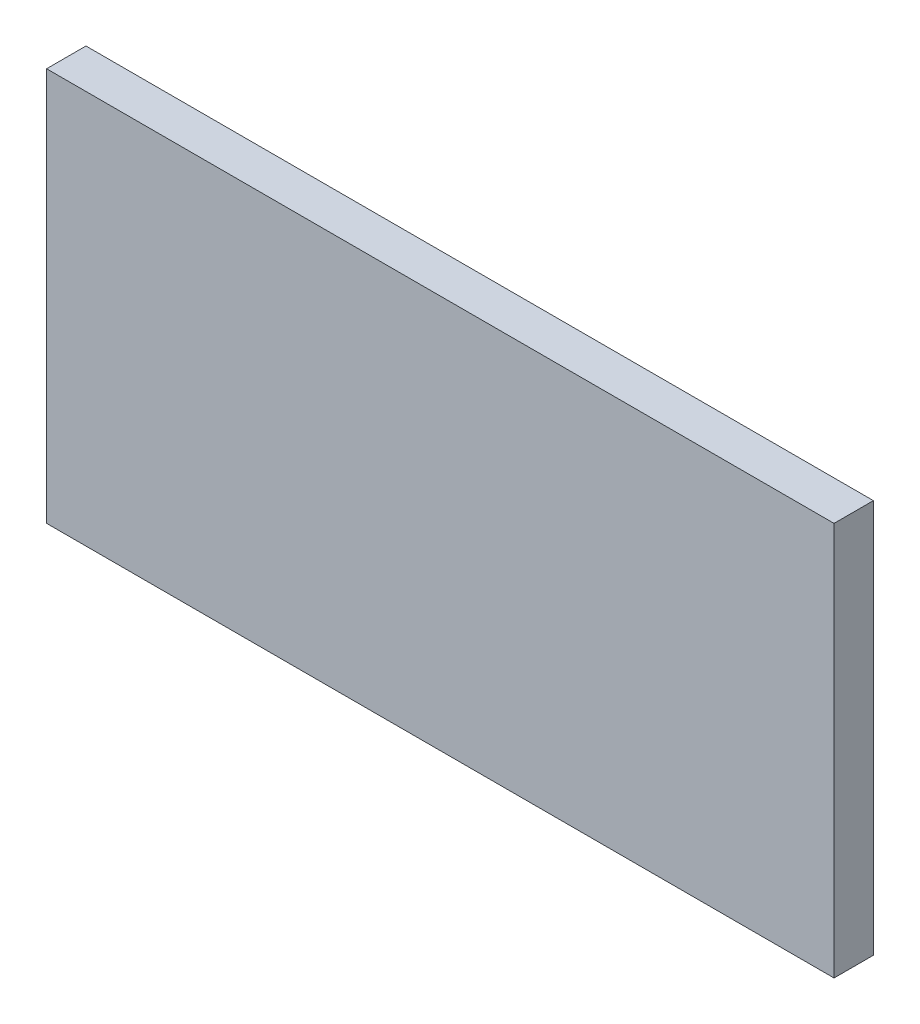
ISO-10303-21;
HEADER;
FILE_DESCRIPTION(('STEP AP214'),'2;1');
FILE_NAME('part.step','',(''),(''),'','','');
FILE_SCHEMA(('AUTOMOTIVE_DESIGN { 1 0 10303 214 1 1 1 1 }'));
ENDSEC;
DATA;
#1=APPLICATION_CONTEXT('core data for automotive mechanical design processes');
#2=APPLICATION_PROTOCOL_DEFINITION('international standard','automotive_design',2000,#1);
#3=PRODUCT_CONTEXT('',#1,'mechanical');
#4=PRODUCT('Part','Part','',(#3));
#5=PRODUCT_RELATED_PRODUCT_CATEGORY('part','',(#4));
#6=PRODUCT_DEFINITION_FORMATION('','',#4);
#7=PRODUCT_DEFINITION_CONTEXT('part definition',#1,'design');
#8=PRODUCT_DEFINITION('design','',#6,#7);
#9=PRODUCT_DEFINITION_SHAPE('','',#8);
#10=(LENGTH_UNIT() NAMED_UNIT(*) SI_UNIT(.MILLI.,.METRE.));
#11=(NAMED_UNIT(*) PLANE_ANGLE_UNIT() SI_UNIT($,.RADIAN.));
#12=(NAMED_UNIT(*) SI_UNIT($,.STERADIAN.) SOLID_ANGLE_UNIT());
#13=UNCERTAINTY_MEASURE_WITH_UNIT(LENGTH_MEASURE(1.E-05),#10,'distance_accuracy_value','');
#14=(GEOMETRIC_REPRESENTATION_CONTEXT(3) GLOBAL_UNCERTAINTY_ASSIGNED_CONTEXT((#13)) GLOBAL_UNIT_ASSIGNED_CONTEXT((#10,
#11,#12)) REPRESENTATION_CONTEXT('',''));
#15=CARTESIAN_POINT('',(0.,0.,0.));
#16=DIRECTION('',(0.,0.,1.));
#17=DIRECTION('',(1.,0.,0.));
#18=AXIS2_PLACEMENT_3D('',#15,#16,#17);
#19=CARTESIAN_POINT('',(0.,0.,1.27));
#20=DIRECTION('',(1.,0.,0.));
#21=DIRECTION('',(0.,0.,-1.));
#22=AXIS2_PLACEMENT_3D('',#19,#20,#21);
#23=PLANE('',#22);
#24=DIRECTION('',(0.,-1.,0.));
#25=VECTOR('',#24,1.);
#26=CARTESIAN_POINT('',(0.,0.,0.));
#27=LINE('',#26,#25);
#28=CARTESIAN_POINT('',(0.,12.7,0.));
#29=VERTEX_POINT('',#28);
#30=CARTESIAN_POINT('',(0.,0.,0.));
#31=VERTEX_POINT('',#30);
#32=EDGE_CURVE('E107',#29,#31,#27,.T.);
#33=ORIENTED_EDGE('',*,*,#32,.T.);
#34=DIRECTION('',(0.,0.,-1.));
#35=VECTOR('',#34,1.);
#36=CARTESIAN_POINT('',(0.,0.,1.27));
#37=LINE('',#36,#35);
#38=CARTESIAN_POINT('',(0.,0.,1.27));
#39=VERTEX_POINT('',#38);
#40=EDGE_CURVE('E11',#39,#31,#37,.T.);
#41=ORIENTED_EDGE('',*,*,#40,.F.);
#42=DIRECTION('',(0.,-1.,0.));
#43=VECTOR('',#42,1.);
#44=CARTESIAN_POINT('',(0.,0.,1.27));
#45=LINE('',#44,#43);
#46=CARTESIAN_POINT('',(0.,12.7,1.27));
#47=VERTEX_POINT('',#46);
#48=EDGE_CURVE('E91',#47,#39,#45,.T.);
#49=ORIENTED_EDGE('',*,*,#48,.F.);
#50=DIRECTION('',(0.,0.,-1.));
#51=VECTOR('',#50,1.);
#52=CARTESIAN_POINT('',(0.,12.7,1.27));
#53=LINE('',#52,#51);
#54=EDGE_CURVE('E103',#47,#29,#53,.T.);
#55=ORIENTED_EDGE('',*,*,#54,.T.);
#56=EDGE_LOOP('',(#33,#41,#49,#55));
#57=FACE_BOUND('',#56,.T.);
#58=ADVANCED_FACE('F39',(#57),#23,.F.);
#59=CARTESIAN_POINT('',(0.,0.,1.27));
#60=DIRECTION('',(0.,1.,0.));
#61=DIRECTION('',(0.,0.,1.));
#62=AXIS2_PLACEMENT_3D('',#59,#60,#61);
#63=PLANE('',#62);
#64=DIRECTION('',(1.,0.,0.));
#65=VECTOR('',#64,1.);
#66=CARTESIAN_POINT('',(0.,0.,0.));
#67=LINE('',#66,#65);
#68=CARTESIAN_POINT('',(25.4,0.,0.));
#69=VERTEX_POINT('',#68);
#70=EDGE_CURVE('E96',#31,#69,#67,.T.);
#71=ORIENTED_EDGE('',*,*,#70,.T.);
#72=DIRECTION('',(0.,0.,-1.));
#73=VECTOR('',#72,1.);
#74=CARTESIAN_POINT('',(25.4,0.,1.27));
#75=LINE('',#74,#73);
#76=CARTESIAN_POINT('',(25.4,0.,1.27));
#77=VERTEX_POINT('',#76);
#78=EDGE_CURVE('E48',#77,#69,#75,.T.);
#79=ORIENTED_EDGE('',*,*,#78,.F.);
#80=DIRECTION('',(1.,0.,0.));
#81=VECTOR('',#80,1.);
#82=CARTESIAN_POINT('',(0.,0.,1.27));
#83=LINE('',#82,#81);
#84=EDGE_CURVE('E86',#39,#77,#83,.T.);
#85=ORIENTED_EDGE('',*,*,#84,.F.);
#86=ORIENTED_EDGE('',*,*,#40,.T.);
#87=EDGE_LOOP('',(#71,#79,#85,#86));
#88=FACE_BOUND('',#87,.T.);
#89=ADVANCED_FACE('F95',(#88),#63,.F.);
#90=CARTESIAN_POINT('',(25.4,0.,1.27));
#91=DIRECTION('',(-1.,0.,0.));
#92=DIRECTION('',(0.,0.,1.));
#93=AXIS2_PLACEMENT_3D('',#90,#91,#92);
#94=PLANE('',#93);
#95=DIRECTION('',(0.,1.,0.));
#96=VECTOR('',#95,1.);
#97=CARTESIAN_POINT('',(25.4,0.,0.));
#98=LINE('',#97,#96);
#99=CARTESIAN_POINT('',(25.4,12.7,0.));
#100=VERTEX_POINT('',#99);
#101=EDGE_CURVE('E73',#69,#100,#98,.T.);
#102=ORIENTED_EDGE('',*,*,#101,.T.);
#103=DIRECTION('',(0.,0.,-1.));
#104=VECTOR('',#103,1.);
#105=CARTESIAN_POINT('',(25.4,12.7,1.27));
#106=LINE('',#105,#104);
#107=CARTESIAN_POINT('',(25.4,12.7,1.27));
#108=VERTEX_POINT('',#107);
#109=EDGE_CURVE('E98',#108,#100,#106,.T.);
#110=ORIENTED_EDGE('',*,*,#109,.F.);
#111=DIRECTION('',(0.,1.,0.));
#112=VECTOR('',#111,1.);
#113=CARTESIAN_POINT('',(25.4,0.,1.27));
#114=LINE('',#113,#112);
#115=EDGE_CURVE('E89',#77,#108,#114,.T.);
#116=ORIENTED_EDGE('',*,*,#115,.F.);
#117=ORIENTED_EDGE('',*,*,#78,.T.);
#118=EDGE_LOOP('',(#102,#110,#116,#117));
#119=FACE_BOUND('',#118,.T.);
#120=ADVANCED_FACE('F99',(#119),#94,.F.);
#121=CARTESIAN_POINT('',(0.,12.7,1.27));
#122=DIRECTION('',(0.,-1.,0.));
#123=DIRECTION('',(0.,0.,-1.));
#124=AXIS2_PLACEMENT_3D('',#121,#122,#123);
#125=PLANE('',#124);
#126=DIRECTION('',(-1.,0.,0.));
#127=VECTOR('',#126,1.);
#128=CARTESIAN_POINT('',(0.,12.7,0.));
#129=LINE('',#128,#127);
#130=EDGE_CURVE('E79',#100,#29,#129,.T.);
#131=ORIENTED_EDGE('',*,*,#130,.T.);
#132=ORIENTED_EDGE('',*,*,#54,.F.);
#133=DIRECTION('',(-1.,0.,0.));
#134=VECTOR('',#133,1.);
#135=CARTESIAN_POINT('',(0.,12.7,1.27));
#136=LINE('',#135,#134);
#137=EDGE_CURVE('E56',#108,#47,#136,.T.);
#138=ORIENTED_EDGE('',*,*,#137,.F.);
#139=ORIENTED_EDGE('',*,*,#109,.T.);
#140=EDGE_LOOP('',(#131,#132,#138,#139));
#141=FACE_BOUND('',#140,.T.);
#142=ADVANCED_FACE('F120',(#141),#125,.F.);
#143=CARTESIAN_POINT('',(0.,0.,1.27));
#144=DIRECTION('',(0.,0.,-1.));
#145=DIRECTION('',(-1.,0.,0.));
#146=AXIS2_PLACEMENT_3D('',#143,#144,#145);
#147=PLANE('',#146);
#148=ORIENTED_EDGE('',*,*,#48,.T.);
#149=ORIENTED_EDGE('',*,*,#84,.T.);
#150=ORIENTED_EDGE('',*,*,#115,.T.);
#151=ORIENTED_EDGE('',*,*,#137,.T.);
#152=EDGE_LOOP('',(#148,#149,#150,#151));
#153=FACE_BOUND('',#152,.T.);
#154=ADVANCED_FACE('F87',(#153),#147,.F.);
#155=CARTESIAN_POINT('',(0.,0.,0.));
#156=DIRECTION('',(0.,0.,-1.));
#157=DIRECTION('',(-1.,0.,0.));
#158=AXIS2_PLACEMENT_3D('',#155,#156,#157);
#159=PLANE('',#158);
#160=ORIENTED_EDGE('',*,*,#32,.F.);
#161=ORIENTED_EDGE('',*,*,#130,.F.);
#162=ORIENTED_EDGE('',*,*,#101,.F.);
#163=ORIENTED_EDGE('',*,*,#70,.F.);
#164=EDGE_LOOP('',(#160,#161,#162,#163));
#165=FACE_BOUND('',#164,.T.);
#166=ADVANCED_FACE('F123',(#165),#159,.T.);
#167=CLOSED_SHELL('',(#58,#89,#120,#142,#154,#166));
#168=MANIFOLD_SOLID_BREP('B2',#167);
#169=ADVANCED_BREP_SHAPE_REPRESENTATION('',(#18,#168),#14);
#170=SHAPE_DEFINITION_REPRESENTATION(#9,#169);
ENDSEC;
END-ISO-10303-21;
